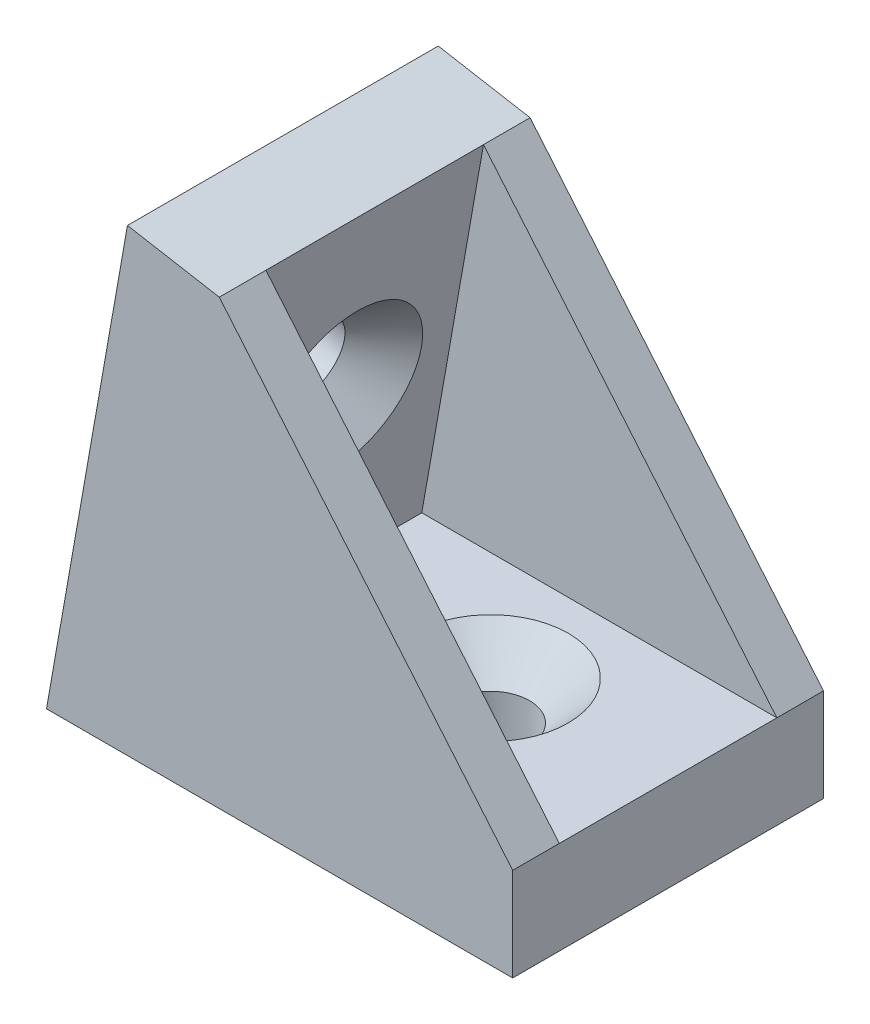
ISO-10303-21;
HEADER;
FILE_DESCRIPTION(('STEP AP214'),'2;1');
FILE_NAME('part.step','',(''),(''),'','','');
FILE_SCHEMA(('AUTOMOTIVE_DESIGN { 1 0 10303 214 1 1 1 1 }'));
ENDSEC;
DATA;
#1=APPLICATION_CONTEXT('core data for automotive mechanical design processes');
#2=APPLICATION_PROTOCOL_DEFINITION('international standard','automotive_design',2000,#1);
#3=PRODUCT_CONTEXT('',#1,'mechanical');
#4=PRODUCT('Part','Part','',(#3));
#5=PRODUCT_RELATED_PRODUCT_CATEGORY('part','',(#4));
#6=PRODUCT_DEFINITION_FORMATION('','',#4);
#7=PRODUCT_DEFINITION_CONTEXT('part definition',#1,'design');
#8=PRODUCT_DEFINITION('design','',#6,#7);
#9=PRODUCT_DEFINITION_SHAPE('','',#8);
#10=(LENGTH_UNIT() NAMED_UNIT(*) SI_UNIT(.MILLI.,.METRE.));
#11=(NAMED_UNIT(*) PLANE_ANGLE_UNIT() SI_UNIT($,.RADIAN.));
#12=(NAMED_UNIT(*) SI_UNIT($,.STERADIAN.) SOLID_ANGLE_UNIT());
#13=UNCERTAINTY_MEASURE_WITH_UNIT(LENGTH_MEASURE(1.E-05),#10,'distance_accuracy_value','');
#14=(GEOMETRIC_REPRESENTATION_CONTEXT(3) GLOBAL_UNCERTAINTY_ASSIGNED_CONTEXT((#13)) GLOBAL_UNIT_ASSIGNED_CONTEXT((#10,
#11,#12)) REPRESENTATION_CONTEXT('',''));
#15=CARTESIAN_POINT('',(0.,0.,0.));
#16=DIRECTION('',(0.,0.,1.));
#17=DIRECTION('',(1.,0.,0.));
#18=AXIS2_PLACEMENT_3D('',#15,#16,#17);
#19=CARTESIAN_POINT('',(7.15052155556529,6.,10.));
#20=DIRECTION('',(0.,-1.,0.));
#21=DIRECTION('',(0.,0.,-1.));
#22=AXIS2_PLACEMENT_3D('',#19,#20,#21);
#23=PLANE('',#22);
#24=CARTESIAN_POINT('',(18.5752607777826,6.,0.));
#25=DIRECTION('',(0.,-1.,0.));
#26=DIRECTION('',(0.,0.,-1.));
#27=AXIS2_PLACEMENT_3D('',#24,#25,#26);
#28=CIRCLE('',#27,5.00000000000002);
#29=CARTESIAN_POINT('',(18.5752607777826,6.,-5.00000000000002));
#30=VERTEX_POINT('',#29);
#31=EDGE_CURVE('E168',#30,#30,#28,.T.);
#32=ORIENTED_EDGE('',*,*,#31,.T.);
#33=EDGE_LOOP('',(#32));
#34=FACE_BOUND('',#33,.T.);
#35=DIRECTION('',(1.,0.,0.));
#36=VECTOR('',#35,1.);
#37=CARTESIAN_POINT('',(7.15052155556529,6.,-7.));
#38=LINE('',#37,#36);
#39=CARTESIAN_POINT('',(7.15052155556529,6.,-7.));
#40=VERTEX_POINT('',#39);
#41=CARTESIAN_POINT('',(30.,6.,-7.));
#42=VERTEX_POINT('',#41);
#43=EDGE_CURVE('E58',#40,#42,#38,.T.);
#44=ORIENTED_EDGE('',*,*,#43,.F.);
#45=DIRECTION('',(0.,0.,-1.));
#46=VECTOR('',#45,1.);
#47=CARTESIAN_POINT('',(7.15052155556529,6.,10.));
#48=LINE('',#47,#46);
#49=CARTESIAN_POINT('',(7.15052155556529,6.,7.));
#50=VERTEX_POINT('',#49);
#51=EDGE_CURVE('E145',#50,#40,#48,.T.);
#52=ORIENTED_EDGE('',*,*,#51,.F.);
#53=DIRECTION('',(1.,0.,0.));
#54=VECTOR('',#53,1.);
#55=CARTESIAN_POINT('',(7.15052155556529,6.,7.));
#56=LINE('',#55,#54);
#57=CARTESIAN_POINT('',(30.,6.,7.));
#58=VERTEX_POINT('',#57);
#59=EDGE_CURVE('E115',#50,#58,#56,.T.);
#60=ORIENTED_EDGE('',*,*,#59,.T.);
#61=DIRECTION('',(0.,0.,-1.));
#62=VECTOR('',#61,1.);
#63=CARTESIAN_POINT('',(30.,6.,10.));
#64=LINE('',#63,#62);
#65=EDGE_CURVE('E147',#58,#42,#64,.T.);
#66=ORIENTED_EDGE('',*,*,#65,.T.);
#67=EDGE_LOOP('',(#44,#52,#60,#66));
#68=FACE_BOUND('',#67,.T.);
#69=ADVANCED_FACE('F41',(#34,#68),#23,.F.);
#70=CARTESIAN_POINT('',(11.1182918480813,28.5023435243646,10.));
#71=DIRECTION('',(-0.984807753012207,0.173648177666934,0.));
#72=DIRECTION('',(-0.173648177666934,-0.984807753012207,0.));
#73=AXIS2_PLACEMENT_3D('',#70,#71,#72);
#74=PLANE('',#73);
#75=CARTESIAN_POINT('',(9.13440670182328,17.2511717621823,0.));
#76=DIRECTION('',(-0.984807753012207,0.173648177666934,0.));
#77=DIRECTION('',(-0.173648177666934,-0.984807753012207,0.));
#78=AXIS2_PLACEMENT_3D('',#75,#76,#77);
#79=CIRCLE('',#78,4.99999999999999);
#80=CARTESIAN_POINT('',(8.26616581348861,12.3271329971213,0.));
#81=VERTEX_POINT('',#80);
#82=EDGE_CURVE('E11',#81,#81,#79,.T.);
#83=ORIENTED_EDGE('',*,*,#82,.T.);
#84=EDGE_LOOP('',(#83));
#85=FACE_BOUND('',#84,.T.);
#86=DIRECTION('',(-0.173648177666934,-0.984807753012207,0.));
#87=VECTOR('',#86,1.);
#88=CARTESIAN_POINT('',(11.1182918480813,28.5023435243646,-7.));
#89=LINE('',#88,#87);
#90=CARTESIAN_POINT('',(11.1182918480813,28.5023435243646,-7.));
#91=VERTEX_POINT('',#90);
#92=EDGE_CURVE('E135',#91,#40,#89,.T.);
#93=ORIENTED_EDGE('',*,*,#92,.F.);
#94=DIRECTION('',(0.,0.,-1.));
#95=VECTOR('',#94,1.);
#96=CARTESIAN_POINT('',(11.1182918480813,28.5023435243646,10.));
#97=LINE('',#96,#95);
#98=CARTESIAN_POINT('',(11.1182918480813,28.5023435243646,7.));
#99=VERTEX_POINT('',#98);
#100=EDGE_CURVE('E132',#99,#91,#97,.T.);
#101=ORIENTED_EDGE('',*,*,#100,.F.);
#102=DIRECTION('',(-0.173648177666934,-0.984807753012207,0.));
#103=VECTOR('',#102,1.);
#104=CARTESIAN_POINT('',(11.1182918480813,28.5023435243646,7.));
#105=LINE('',#104,#103);
#106=EDGE_CURVE('E110',#99,#50,#105,.T.);
#107=ORIENTED_EDGE('',*,*,#106,.T.);
#108=ORIENTED_EDGE('',*,*,#51,.T.);
#109=EDGE_LOOP('',(#93,#101,#107,#108));
#110=FACE_BOUND('',#109,.T.);
#111=ADVANCED_FACE('F133',(#85,#110),#74,.F.);
#112=CARTESIAN_POINT('',(30.,0.,10.));
#113=DIRECTION('',(0.,1.,0.));
#114=DIRECTION('',(-1.,0.,0.));
#115=AXIS2_PLACEMENT_3D('',#112,#113,#114);
#116=PLANE('',#115);
#117=CARTESIAN_POINT('',(18.5752607777826,0.,0.));
#118=DIRECTION('',(0.,1.,0.));
#119=DIRECTION('',(0.,0.,1.));
#120=AXIS2_PLACEMENT_3D('',#117,#118,#119);
#121=CIRCLE('',#120,2.5);
#122=CARTESIAN_POINT('',(18.5752607777826,0.,2.5));
#123=VERTEX_POINT('',#122);
#124=EDGE_CURVE('E164',#123,#123,#121,.T.);
#125=ORIENTED_EDGE('',*,*,#124,.T.);
#126=EDGE_LOOP('',(#125));
#127=FACE_BOUND('',#126,.T.);
#128=DIRECTION('',(1.,0.,0.));
#129=VECTOR('',#128,1.);
#130=CARTESIAN_POINT('',(30.,0.,-10.));
#131=LINE('',#130,#129);
#132=CARTESIAN_POINT('',(0.,0.,-10.));
#133=VERTEX_POINT('',#132);
#134=CARTESIAN_POINT('',(30.,0.,-10.));
#135=VERTEX_POINT('',#134);
#136=EDGE_CURVE('E217',#133,#135,#131,.T.);
#137=ORIENTED_EDGE('',*,*,#136,.T.);
#138=DIRECTION('',(0.,0.,-1.));
#139=VECTOR('',#138,1.);
#140=CARTESIAN_POINT('',(30.,0.,10.));
#141=LINE('',#140,#139);
#142=CARTESIAN_POINT('',(30.,0.,10.));
#143=VERTEX_POINT('',#142);
#144=EDGE_CURVE('E154',#143,#135,#141,.T.);
#145=ORIENTED_EDGE('',*,*,#144,.F.);
#146=DIRECTION('',(1.,0.,0.));
#147=VECTOR('',#146,1.);
#148=CARTESIAN_POINT('',(30.,0.,10.));
#149=LINE('',#148,#147);
#150=CARTESIAN_POINT('',(0.,0.,10.));
#151=VERTEX_POINT('',#150);
#152=EDGE_CURVE('E239',#151,#143,#149,.T.);
#153=ORIENTED_EDGE('',*,*,#152,.F.);
#154=DIRECTION('',(0.,0.,-1.));
#155=VECTOR('',#154,1.);
#156=CARTESIAN_POINT('',(0.,0.,10.));
#157=LINE('',#156,#155);
#158=EDGE_CURVE('E220',#151,#133,#157,.T.);
#159=ORIENTED_EDGE('',*,*,#158,.T.);
#160=EDGE_LOOP('',(#137,#145,#153,#159));
#161=FACE_BOUND('',#160,.T.);
#162=ADVANCED_FACE('F193',(#127,#161),#116,.F.);
#163=CARTESIAN_POINT('',(30.,6.,10.));
#164=DIRECTION('',(-1.,0.,0.));
#165=DIRECTION('',(0.,0.,1.));
#166=AXIS2_PLACEMENT_3D('',#163,#164,#165);
#167=PLANE('',#166);
#168=DIRECTION('',(0.,1.,0.));
#169=VECTOR('',#168,1.);
#170=CARTESIAN_POINT('',(30.,6.,-10.));
#171=LINE('',#170,#169);
#172=CARTESIAN_POINT('',(30.,6.,-10.));
#173=VERTEX_POINT('',#172);
#174=EDGE_CURVE('E224',#135,#173,#171,.T.);
#175=ORIENTED_EDGE('',*,*,#174,.T.);
#176=DIRECTION('',(0.,0.,-1.));
#177=VECTOR('',#176,1.);
#178=CARTESIAN_POINT('',(30.,6.,-7.));
#179=LINE('',#178,#177);
#180=EDGE_CURVE('E66',#42,#173,#179,.T.);
#181=ORIENTED_EDGE('',*,*,#180,.F.);
#182=ORIENTED_EDGE('',*,*,#65,.F.);
#183=CARTESIAN_POINT('',(30.,6.,10.));
#184=VERTEX_POINT('',#183);
#185=EDGE_CURVE('E127',#184,#58,#64,.T.);
#186=ORIENTED_EDGE('',*,*,#185,.F.);
#187=DIRECTION('',(0.,1.,0.));
#188=VECTOR('',#187,1.);
#189=CARTESIAN_POINT('',(30.,6.,10.));
#190=LINE('',#189,#188);
#191=EDGE_CURVE('E248',#143,#184,#190,.T.);
#192=ORIENTED_EDGE('',*,*,#191,.F.);
#193=ORIENTED_EDGE('',*,*,#144,.T.);
#194=EDGE_LOOP('',(#175,#181,#182,#186,#192,#193));
#195=FACE_BOUND('',#194,.T.);
#196=ADVANCED_FACE('F198',(#195),#167,.F.);
#197=CARTESIAN_POINT('',(5.20944533000802,29.5442325903662,10.));
#198=DIRECTION('',(-0.173648177666933,-0.984807753012208,0.));
#199=DIRECTION('',(0.984807753012208,-0.173648177666933,0.));
#200=AXIS2_PLACEMENT_3D('',#197,#198,#199);
#201=PLANE('',#200);
#202=DIRECTION('',(-0.984807753012208,0.173648177666933,0.));
#203=VECTOR('',#202,1.);
#204=CARTESIAN_POINT('',(5.20944533000802,29.5442325903662,-10.));
#205=LINE('',#204,#203);
#206=CARTESIAN_POINT('',(11.1182918480813,28.5023435243646,-10.));
#207=VERTEX_POINT('',#206);
#208=CARTESIAN_POINT('',(5.20944533000802,29.5442325903662,-10.));
#209=VERTEX_POINT('',#208);
#210=EDGE_CURVE('E228',#207,#209,#205,.T.);
#211=ORIENTED_EDGE('',*,*,#210,.T.);
#212=DIRECTION('',(0.,0.,-1.));
#213=VECTOR('',#212,1.);
#214=CARTESIAN_POINT('',(5.20944533000802,29.5442325903662,10.));
#215=LINE('',#214,#213);
#216=CARTESIAN_POINT('',(5.20944533000802,29.5442325903662,10.));
#217=VERTEX_POINT('',#216);
#218=EDGE_CURVE('E139',#217,#209,#215,.T.);
#219=ORIENTED_EDGE('',*,*,#218,.F.);
#220=DIRECTION('',(-0.984807753012208,0.173648177666933,0.));
#221=VECTOR('',#220,1.);
#222=CARTESIAN_POINT('',(5.20944533000802,29.5442325903662,10.));
#223=LINE('',#222,#221);
#224=CARTESIAN_POINT('',(11.1182918480813,28.5023435243646,10.));
#225=VERTEX_POINT('',#224);
#226=EDGE_CURVE('E143',#225,#217,#223,.T.);
#227=ORIENTED_EDGE('',*,*,#226,.F.);
#228=EDGE_CURVE('E124',#225,#99,#97,.T.);
#229=ORIENTED_EDGE('',*,*,#228,.T.);
#230=ORIENTED_EDGE('',*,*,#100,.T.);
#231=DIRECTION('',(0.,0.,-1.));
#232=VECTOR('',#231,1.);
#233=CARTESIAN_POINT('',(11.1182918480813,28.5023435243646,-7.));
#234=LINE('',#233,#232);
#235=EDGE_CURVE('E256',#91,#207,#234,.T.);
#236=ORIENTED_EDGE('',*,*,#235,.T.);
#237=EDGE_LOOP('',(#211,#219,#227,#229,#230,#236));
#238=FACE_BOUND('',#237,.T.);
#239=ADVANCED_FACE('F141',(#238),#201,.F.);
#240=CARTESIAN_POINT('',(0.,0.,10.));
#241=DIRECTION('',(0.984807753012207,-0.173648177666934,0.));
#242=DIRECTION('',(0.173648177666934,0.984807753012208,0.));
#243=AXIS2_PLACEMENT_3D('',#240,#241,#242);
#244=PLANE('',#243);
#245=CARTESIAN_POINT('',(3.22556018375003,18.2930608281839,0.));
#246=DIRECTION('',(0.984807753012207,-0.173648177666934,0.));
#247=DIRECTION('',(0.173648177666934,0.984807753012208,0.));
#248=AXIS2_PLACEMENT_3D('',#245,#246,#247);
#249=CIRCLE('',#248,2.5);
#250=CARTESIAN_POINT('',(3.65968062791737,20.7550802107144,0.));
#251=VERTEX_POINT('',#250);
#252=EDGE_CURVE('E159',#251,#251,#249,.T.);
#253=ORIENTED_EDGE('',*,*,#252,.T.);
#254=EDGE_LOOP('',(#253));
#255=FACE_BOUND('',#254,.T.);
#256=DIRECTION('',(-0.173648177666934,-0.984807753012207,0.));
#257=VECTOR('',#256,1.);
#258=CARTESIAN_POINT('',(0.,0.,-10.));
#259=LINE('',#258,#257);
#260=EDGE_CURVE('E237',#209,#133,#259,.T.);
#261=ORIENTED_EDGE('',*,*,#260,.T.);
#262=ORIENTED_EDGE('',*,*,#158,.F.);
#263=DIRECTION('',(-0.173648177666934,-0.984807753012207,0.));
#264=VECTOR('',#263,1.);
#265=CARTESIAN_POINT('',(0.,0.,10.));
#266=LINE('',#265,#264);
#267=EDGE_CURVE('E232',#217,#151,#266,.T.);
#268=ORIENTED_EDGE('',*,*,#267,.F.);
#269=ORIENTED_EDGE('',*,*,#218,.T.);
#270=EDGE_LOOP('',(#261,#262,#268,#269));
#271=FACE_BOUND('',#270,.T.);
#272=ADVANCED_FACE('F283',(#255,#271),#244,.F.);
#273=CARTESIAN_POINT('',(0.,0.,10.));
#274=DIRECTION('',(0.,0.,1.));
#275=DIRECTION('',(1.,0.,0.));
#276=AXIS2_PLACEMENT_3D('',#273,#274,#275);
#277=PLANE('',#276);
#278=ORIENTED_EDGE('',*,*,#152,.T.);
#279=ORIENTED_EDGE('',*,*,#191,.T.);
#280=DIRECTION('',(-0.642787609686538,0.766044443118979,0.));
#281=VECTOR('',#280,1.);
#282=CARTESIAN_POINT('',(30.,6.,10.));
#283=LINE('',#282,#281);
#284=EDGE_CURVE('E129',#184,#225,#283,.T.);
#285=ORIENTED_EDGE('',*,*,#284,.T.);
#286=ORIENTED_EDGE('',*,*,#226,.T.);
#287=ORIENTED_EDGE('',*,*,#267,.T.);
#288=EDGE_LOOP('',(#278,#279,#285,#286,#287));
#289=FACE_BOUND('',#288,.T.);
#290=ADVANCED_FACE('F284',(#289),#277,.T.);
#291=CARTESIAN_POINT('',(0.,0.,-10.));
#292=DIRECTION('',(0.,0.,1.));
#293=DIRECTION('',(1.,0.,0.));
#294=AXIS2_PLACEMENT_3D('',#291,#292,#293);
#295=PLANE('',#294);
#296=ORIENTED_EDGE('',*,*,#210,.F.);
#297=DIRECTION('',(-0.642787609686538,0.766044443118979,0.));
#298=VECTOR('',#297,1.);
#299=CARTESIAN_POINT('',(30.,6.,-10.));
#300=LINE('',#299,#298);
#301=EDGE_CURVE('E163',#173,#207,#300,.T.);
#302=ORIENTED_EDGE('',*,*,#301,.F.);
#303=ORIENTED_EDGE('',*,*,#174,.F.);
#304=ORIENTED_EDGE('',*,*,#136,.F.);
#305=ORIENTED_EDGE('',*,*,#260,.F.);
#306=EDGE_LOOP('',(#296,#302,#303,#304,#305));
#307=FACE_BOUND('',#306,.T.);
#308=ADVANCED_FACE('F281',(#307),#295,.F.);
#309=CARTESIAN_POINT('',(30.,6.,7.));
#310=DIRECTION('',(0.766044443118979,0.642787609686538,0.));
#311=DIRECTION('',(-0.642787609686538,0.766044443118979,0.));
#312=AXIS2_PLACEMENT_3D('',#309,#310,#311);
#313=PLANE('',#312);
#314=ORIENTED_EDGE('',*,*,#284,.F.);
#315=ORIENTED_EDGE('',*,*,#185,.T.);
#316=DIRECTION('',(-0.642787609686538,0.766044443118979,0.));
#317=VECTOR('',#316,1.);
#318=CARTESIAN_POINT('',(30.,6.,7.));
#319=LINE('',#318,#317);
#320=EDGE_CURVE('E113',#58,#99,#319,.T.);
#321=ORIENTED_EDGE('',*,*,#320,.T.);
#322=ORIENTED_EDGE('',*,*,#228,.F.);
#323=EDGE_LOOP('',(#314,#315,#321,#322));
#324=FACE_BOUND('',#323,.T.);
#325=ADVANCED_FACE('F122',(#324),#313,.T.);
#326=CARTESIAN_POINT('',(0.,0.,7.));
#327=DIRECTION('',(0.,0.,1.));
#328=DIRECTION('',(1.,0.,0.));
#329=AXIS2_PLACEMENT_3D('',#326,#327,#328);
#330=PLANE('',#329);
#331=ORIENTED_EDGE('',*,*,#320,.F.);
#332=ORIENTED_EDGE('',*,*,#59,.F.);
#333=ORIENTED_EDGE('',*,*,#106,.F.);
#334=EDGE_LOOP('',(#331,#332,#333));
#335=FACE_BOUND('',#334,.T.);
#336=ADVANCED_FACE('F112',(#335),#330,.F.);
#337=CARTESIAN_POINT('',(30.,6.,-7.));
#338=DIRECTION('',(-0.766044443118979,-0.642787609686538,0.));
#339=DIRECTION('',(0.642787609686538,-0.766044443118979,0.));
#340=AXIS2_PLACEMENT_3D('',#337,#338,#339);
#341=PLANE('',#340);
#342=ORIENTED_EDGE('',*,*,#301,.T.);
#343=ORIENTED_EDGE('',*,*,#235,.F.);
#344=DIRECTION('',(-0.642787609686538,0.766044443118979,0.));
#345=VECTOR('',#344,1.);
#346=CARTESIAN_POINT('',(30.,6.,-7.));
#347=LINE('',#346,#345);
#348=EDGE_CURVE('E265',#42,#91,#347,.T.);
#349=ORIENTED_EDGE('',*,*,#348,.F.);
#350=ORIENTED_EDGE('',*,*,#180,.T.);
#351=EDGE_LOOP('',(#342,#343,#349,#350));
#352=FACE_BOUND('',#351,.T.);
#353=ADVANCED_FACE('F278',(#352),#341,.F.);
#354=CARTESIAN_POINT('',(0.,0.,-7.));
#355=DIRECTION('',(0.,0.,-1.));
#356=DIRECTION('',(1.,0.,0.));
#357=AXIS2_PLACEMENT_3D('',#354,#355,#356);
#358=PLANE('',#357);
#359=ORIENTED_EDGE('',*,*,#348,.T.);
#360=ORIENTED_EDGE('',*,*,#92,.T.);
#361=ORIENTED_EDGE('',*,*,#43,.T.);
#362=EDGE_LOOP('',(#359,#360,#361));
#363=FACE_BOUND('',#362,.T.);
#364=ADVANCED_FACE('F276',(#363),#358,.F.);
#365=CARTESIAN_POINT('',(-1.82680114875205,19.1839284473922,0.));
#366=DIRECTION('',(0.984807753012207,-0.173648177666934,0.));
#367=DIRECTION('',(0.173648177666934,0.984807753012207,0.));
#368=AXIS2_PLACEMENT_3D('',#365,#366,#367);
#369=CYLINDRICAL_SURFACE('',#368,2.5);
#370=CARTESIAN_POINT('',(6.67238731929277,17.6852922063496,0.));
#371=DIRECTION('',(-0.984807753012207,0.173648177666935,0.));
#372=DIRECTION('',(-0.173648177666935,-0.984807753012207,0.));
#373=AXIS2_PLACEMENT_3D('',#370,#371,#372);
#374=CIRCLE('',#373,2.5);
#375=CARTESIAN_POINT('',(6.23826687512544,15.2232728238191,0.));
#376=VERTEX_POINT('',#375);
#377=EDGE_CURVE('E51',#376,#376,#374,.F.);
#378=ORIENTED_EDGE('',*,*,#377,.T.);
#379=EDGE_LOOP('',(#378));
#380=FACE_BOUND('',#379,.T.);
#381=ORIENTED_EDGE('',*,*,#252,.F.);
#382=EDGE_LOOP('',(#381));
#383=FACE_BOUND('',#382,.T.);
#384=ADVANCED_FACE('F175',(#380,#383),#369,.F.);
#385=CARTESIAN_POINT('',(18.5752607777826,0.,0.));
#386=DIRECTION('',(0.,1.,0.));
#387=DIRECTION('',(0.,0.,1.));
#388=AXIS2_PLACEMENT_3D('',#385,#386,#387);
#389=CYLINDRICAL_SURFACE('',#388,2.5);
#390=CARTESIAN_POINT('',(18.5752607777826,3.49999999999999,0.));
#391=DIRECTION('',(0.,-1.,0.));
#392=DIRECTION('',(0.,0.,-1.));
#393=AXIS2_PLACEMENT_3D('',#390,#391,#392);
#394=CIRCLE('',#393,2.5);
#395=CARTESIAN_POINT('',(18.5752607777826,3.49999999999999,2.5));
#396=VERTEX_POINT('',#395);
#397=EDGE_CURVE('E158',#396,#396,#394,.F.);
#398=CARTESIAN_POINT('',(18.5752607777826,3.49999999999999,2.5));
#399=CARTESIAN_POINT('',(18.5752607777826,3.46354166666665,2.5));
#400=CARTESIAN_POINT('',(18.5752607777826,3.42708333333332,2.5));
#401=CARTESIAN_POINT('',(18.5752607777826,3.35416666666665,2.5));
#402=CARTESIAN_POINT('',(18.5752607777826,3.31770833333332,2.5));
#403=CARTESIAN_POINT('',(18.5752607777826,3.24479166666665,2.5));
#404=CARTESIAN_POINT('',(18.5752607777826,3.20833333333332,2.5));
#405=CARTESIAN_POINT('',(18.5752607777826,3.13541666666665,2.5));
#406=CARTESIAN_POINT('',(18.5752607777826,3.09895833333332,2.5));
#407=CARTESIAN_POINT('',(18.5752607777826,3.02604166666665,2.5));
#408=CARTESIAN_POINT('',(18.5752607777826,2.98958333333332,2.5));
#409=CARTESIAN_POINT('',(18.5752607777826,2.91666666666666,2.5));
#410=CARTESIAN_POINT('',(18.5752607777826,2.88020833333332,2.5));
#411=CARTESIAN_POINT('',(18.5752607777826,2.80729166666666,2.5));
#412=CARTESIAN_POINT('',(18.5752607777826,2.77083333333332,2.5));
#413=CARTESIAN_POINT('',(18.5752607777826,2.69791666666666,2.5));
#414=CARTESIAN_POINT('',(18.5752607777826,2.66145833333332,2.5));
#415=CARTESIAN_POINT('',(18.5752607777826,2.58854166666666,2.5));
#416=CARTESIAN_POINT('',(18.5752607777826,2.55208333333332,2.5));
#417=CARTESIAN_POINT('',(18.5752607777826,2.47916666666666,2.5));
#418=CARTESIAN_POINT('',(18.5752607777826,2.44270833333332,2.5));
#419=CARTESIAN_POINT('',(18.5752607777826,2.36979166666666,2.5));
#420=CARTESIAN_POINT('',(18.5752607777826,2.33333333333332,2.5));
#421=CARTESIAN_POINT('',(18.5752607777826,2.26041666666666,2.5));
#422=CARTESIAN_POINT('',(18.5752607777826,2.22395833333332,2.5));
#423=CARTESIAN_POINT('',(18.5752607777826,2.15104166666666,2.5));
#424=CARTESIAN_POINT('',(18.5752607777826,2.11458333333333,2.5));
#425=CARTESIAN_POINT('',(18.5752607777826,2.04166666666666,2.5));
#426=CARTESIAN_POINT('',(18.5752607777826,2.00520833333333,2.5));
#427=CARTESIAN_POINT('',(18.5752607777826,1.93229166666666,2.5));
#428=CARTESIAN_POINT('',(18.5752607777826,1.89583333333333,2.5));
#429=CARTESIAN_POINT('',(18.5752607777826,1.82291666666666,2.5));
#430=CARTESIAN_POINT('',(18.5752607777826,1.78645833333333,2.5));
#431=CARTESIAN_POINT('',(18.5752607777826,1.71354166666666,2.5));
#432=CARTESIAN_POINT('',(18.5752607777826,1.67708333333333,2.5));
#433=CARTESIAN_POINT('',(18.5752607777826,1.60416666666666,2.5));
#434=CARTESIAN_POINT('',(18.5752607777826,1.56770833333333,2.5));
#435=CARTESIAN_POINT('',(18.5752607777826,1.49479166666666,2.5));
#436=CARTESIAN_POINT('',(18.5752607777826,1.45833333333333,2.5));
#437=CARTESIAN_POINT('',(18.5752607777826,1.38541666666666,2.5));
#438=CARTESIAN_POINT('',(18.5752607777826,1.34895833333333,2.5));
#439=CARTESIAN_POINT('',(18.5752607777826,1.27604166666666,2.5));
#440=CARTESIAN_POINT('',(18.5752607777826,1.23958333333333,2.5));
#441=CARTESIAN_POINT('',(18.5752607777826,1.16666666666666,2.5));
#442=CARTESIAN_POINT('',(18.5752607777826,1.13020833333333,2.5));
#443=CARTESIAN_POINT('',(18.5752607777826,1.05729166666666,2.5));
#444=CARTESIAN_POINT('',(18.5752607777826,1.02083333333333,2.5));
#445=CARTESIAN_POINT('',(18.5752607777826,0.947916666666662,2.5));
#446=CARTESIAN_POINT('',(18.5752607777826,0.911458333333329,2.5));
#447=CARTESIAN_POINT('',(18.5752607777826,0.838541666666663,2.5));
#448=CARTESIAN_POINT('',(18.5752607777826,0.80208333333333,2.5));
#449=CARTESIAN_POINT('',(18.5752607777826,0.729166666666663,2.5));
#450=CARTESIAN_POINT('',(18.5752607777826,0.69270833333333,2.5));
#451=CARTESIAN_POINT('',(18.5752607777826,0.619791666666664,2.5));
#452=CARTESIAN_POINT('',(18.5752607777826,0.583333333333331,2.5));
#453=CARTESIAN_POINT('',(18.5752607777826,0.510416666666664,2.5));
#454=CARTESIAN_POINT('',(18.5752607777826,0.473958333333331,2.5));
#455=CARTESIAN_POINT('',(18.5752607777826,0.401041666666665,2.5));
#456=CARTESIAN_POINT('',(18.5752607777826,0.364583333333331,2.5));
#457=CARTESIAN_POINT('',(18.5752607777826,0.291666666666665,2.5));
#458=CARTESIAN_POINT('',(18.5752607777826,0.255208333333332,2.5));
#459=CARTESIAN_POINT('',(18.5752607777826,0.182291666666665,2.5));
#460=CARTESIAN_POINT('',(18.5752607777826,0.145833333333332,2.5));
#461=CARTESIAN_POINT('',(18.5752607777826,0.0729166666666656,2.5));
#462=CARTESIAN_POINT('',(18.5752607777826,0.0364583333333324,2.5));
#463=CARTESIAN_POINT('',(18.5752607777826,0.,2.5));
#464=B_SPLINE_CURVE_WITH_KNOTS('',3,(#398,#399,#400,#401,#402,#403,#404,#405,#406,#407,#408,
#409,#410,#411,#412,#413,#414,#415,#416,#417,#418,#419,#420,#421,#422,#423,#424,#425,#426,#427,
#428,#429,#430,#431,#432,#433,#434,#435,#436,#437,#438,#439,#440,#441,#442,#443,#444,#445,#446,
#447,#448,#449,#450,#451,#452,#453,#454,#455,#456,#457,#458,#459,#460,#461,#462,#463),
.UNSPECIFIED.,.F.,.F.,(4,2,2,2,2,2,2,2,2,2,2,2,2,2,2,2,2,2,2,2,2,2,2,2,2,2,2,2,2,2,2,2,4),(0.,
0.109375,0.218749999999999,0.328124999999999,0.437499999999999,0.546874999999998,
0.656249999999998,0.765624999999997,0.874999999999997,0.984374999999997,1.09375,1.203125,1.3125,
1.421875,1.53124999999999,1.64062499999999,1.74999999999999,1.85937499999999,1.96874999999999,
2.07812499999999,2.18749999999999,2.29687499999999,2.40624999999999,2.51562499999999,
2.62499999999999,2.73437499999999,2.84374999999999,2.95312499999999,3.06249999999999,
3.17187499999999,3.28124999999999,3.39062499999999,3.49999999999999),.UNSPECIFIED.);
#465=EDGE_CURVE('BSEAM184',#396,#123,#464,.T.);
#466=ORIENTED_EDGE('',*,*,#397,.T.);
#467=ORIENTED_EDGE('',*,*,#124,.F.);
#468=ORIENTED_EDGE('',*,*,#465,.T.);
#469=ORIENTED_EDGE('',*,*,#465,.F.);
#470=EDGE_LOOP('',(#466,#468,#467,#469));
#471=FACE_BOUND('',#470,.T.);
#472=ADVANCED_FACE('F184',(#471),#389,.F.);
#473=CARTESIAN_POINT('',(18.5752607777826,3.49999999999999,0.));
#474=DIRECTION('',(0.,1.,0.));
#475=DIRECTION('',(0.,0.,1.));
#476=AXIS2_PLACEMENT_3D('',#473,#474,#475);
#477=CONICAL_SURFACE('',#476,2.5,0.785398163397451);
#478=ORIENTED_EDGE('',*,*,#31,.F.);
#479=EDGE_LOOP('',(#478));
#480=FACE_BOUND('',#479,.T.);
#481=ORIENTED_EDGE('',*,*,#397,.F.);
#482=EDGE_LOOP('',(#481));
#483=FACE_BOUND('',#482,.T.);
#484=ADVANCED_FACE('F179',(#480,#483),#477,.F.);
#485=CARTESIAN_POINT('',(6.67238731929278,17.6852922063496,0.));
#486=DIRECTION('',(0.984807753012207,-0.173648177666935,0.));
#487=DIRECTION('',(0.173648177666935,0.984807753012207,0.));
#488=AXIS2_PLACEMENT_3D('',#485,#486,#487);
#489=CONICAL_SURFACE('',#488,2.5,0.78539816339745);
#490=ORIENTED_EDGE('',*,*,#82,.F.);
#491=EDGE_LOOP('',(#490));
#492=FACE_BOUND('',#491,.T.);
#493=ORIENTED_EDGE('',*,*,#377,.F.);
#494=EDGE_LOOP('',(#493));
#495=FACE_BOUND('',#494,.T.);
#496=ADVANCED_FACE('F44',(#492,#495),#489,.F.);
#497=CLOSED_SHELL('',(#69,#111,#162,#196,#239,#272,#290,#308,#325,#336,#353,#364,#384,#472,#484,#496));
#498=MANIFOLD_SOLID_BREP('B2',#497);
#499=ADVANCED_BREP_SHAPE_REPRESENTATION('',(#18,#498),#14);
#500=SHAPE_DEFINITION_REPRESENTATION(#9,#499);
ENDSEC;
END-ISO-10303-21;
